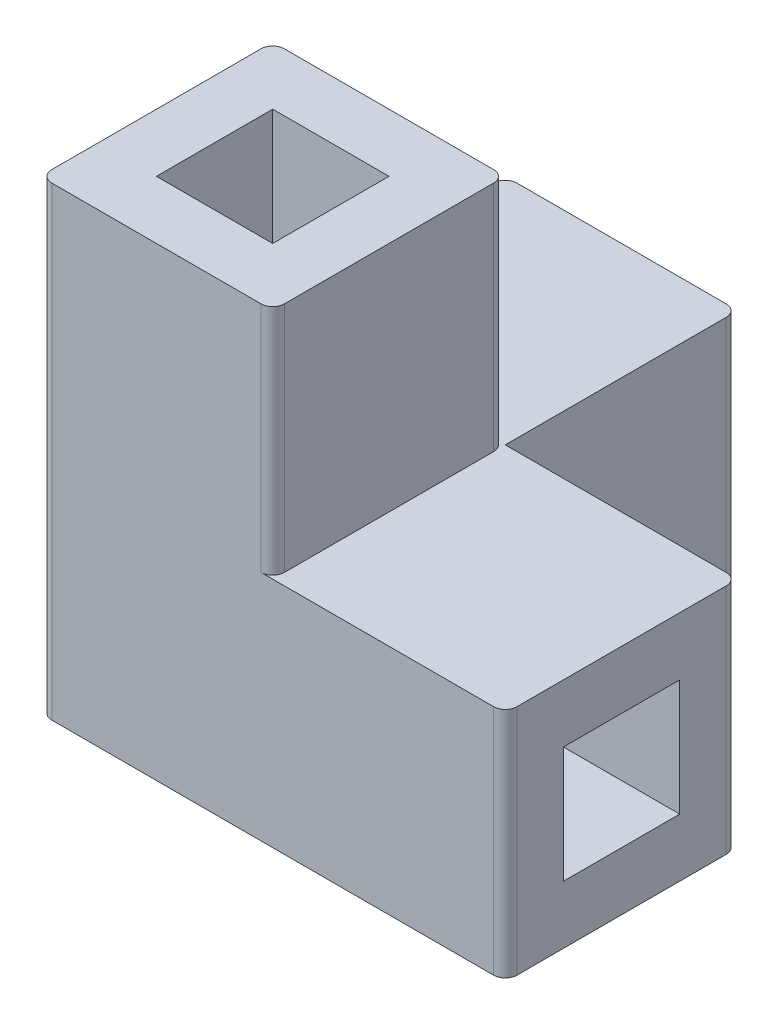
ISO-10303-21;
HEADER;
FILE_DESCRIPTION(('STEP AP214'),'2;1');
FILE_NAME('part.step','',(''),(''),'','','');
FILE_SCHEMA(('AUTOMOTIVE_DESIGN { 1 0 10303 214 1 1 1 1 }'));
ENDSEC;
DATA;
#1=APPLICATION_CONTEXT('core data for automotive mechanical design processes');
#2=APPLICATION_PROTOCOL_DEFINITION('international standard','automotive_design',2000,#1);
#3=PRODUCT_CONTEXT('',#1,'mechanical');
#4=PRODUCT('Part','Part','',(#3));
#5=PRODUCT_RELATED_PRODUCT_CATEGORY('part','',(#4));
#6=PRODUCT_DEFINITION_FORMATION('','',#4);
#7=PRODUCT_DEFINITION_CONTEXT('part definition',#1,'design');
#8=PRODUCT_DEFINITION('design','',#6,#7);
#9=PRODUCT_DEFINITION_SHAPE('','',#8);
#10=(LENGTH_UNIT() NAMED_UNIT(*) SI_UNIT(.MILLI.,.METRE.));
#11=(NAMED_UNIT(*) PLANE_ANGLE_UNIT() SI_UNIT($,.RADIAN.));
#12=(NAMED_UNIT(*) SI_UNIT($,.STERADIAN.) SOLID_ANGLE_UNIT());
#13=UNCERTAINTY_MEASURE_WITH_UNIT(LENGTH_MEASURE(1.E-05),#10,'distance_accuracy_value','');
#14=(GEOMETRIC_REPRESENTATION_CONTEXT(3) GLOBAL_UNCERTAINTY_ASSIGNED_CONTEXT((#13)) GLOBAL_UNIT_ASSIGNED_CONTEXT((#10,
#11,#12)) REPRESENTATION_CONTEXT('',''));
#15=CARTESIAN_POINT('',(0.,0.,0.));
#16=DIRECTION('',(0.,0.,1.));
#17=DIRECTION('',(1.,0.,0.));
#18=AXIS2_PLACEMENT_3D('',#15,#16,#17);
#19=CARTESIAN_POINT('',(30.,0.,-30.));
#20=DIRECTION('',(1.,0.,0.));
#21=DIRECTION('',(0.,0.,-1.));
#22=AXIS2_PLACEMENT_3D('',#19,#20,#21);
#23=PLANE('',#22);
#24=DIRECTION('',(0.,1.,0.));
#25=VECTOR('',#24,1.);
#26=CARTESIAN_POINT('',(30.,0.,-10.));
#27=LINE('',#26,#25);
#28=CARTESIAN_POINT('',(30.,0.,-10.));
#29=VERTEX_POINT('',#28);
#30=CARTESIAN_POINT('',(30.,9.99999999999999,-10.));
#31=VERTEX_POINT('',#30);
#32=EDGE_CURVE('E360',#29,#31,#27,.T.);
#33=ORIENTED_EDGE('',*,*,#32,.T.);
#34=DIRECTION('',(0.,0.,-1.));
#35=VECTOR('',#34,1.);
#36=CARTESIAN_POINT('',(30.,9.99999999999999,-30.));
#37=LINE('',#36,#35);
#38=CARTESIAN_POINT('',(30.,9.99999999999999,-30.));
#39=VERTEX_POINT('',#38);
#40=EDGE_CURVE('E277',#31,#39,#37,.T.);
#41=ORIENTED_EDGE('',*,*,#40,.T.);
#42=DIRECTION('',(0.,1.,0.));
#43=VECTOR('',#42,1.);
#44=CARTESIAN_POINT('',(30.,0.,-30.));
#45=LINE('',#44,#43);
#46=CARTESIAN_POINT('',(30.,0.,-30.));
#47=VERTEX_POINT('',#46);
#48=EDGE_CURVE('E355',#47,#39,#45,.T.);
#49=ORIENTED_EDGE('',*,*,#48,.F.);
#50=DIRECTION('',(0.,0.,-1.));
#51=VECTOR('',#50,1.);
#52=CARTESIAN_POINT('',(30.,0.,-30.));
#53=LINE('',#52,#51);
#54=EDGE_CURVE('E327',#29,#47,#53,.T.);
#55=ORIENTED_EDGE('',*,*,#54,.F.);
#56=EDGE_LOOP('',(#33,#41,#49,#55));
#57=FACE_BOUND('',#56,.T.);
#58=ADVANCED_FACE('F49',(#57),#23,.F.);
#59=DIRECTION('',(0.,0.,-1.));
#60=VECTOR('',#59,1.);
#61=CARTESIAN_POINT('',(30.,9.99999999999999,-9.99999999999999));
#62=LINE('',#61,#60);
#63=CARTESIAN_POINT('',(30.,9.99999999999999,-80.));
#64=VERTEX_POINT('',#63);
#65=EDGE_CURVE('E296',#39,#64,#62,.T.);
#66=ORIENTED_EDGE('',*,*,#65,.F.);
#67=DIRECTION('',(0.,1.,0.));
#68=VECTOR('',#67,1.);
#69=CARTESIAN_POINT('',(30.,0.,-30.));
#70=LINE('',#69,#68);
#71=CARTESIAN_POINT('',(30.,30.,-30.));
#72=VERTEX_POINT('',#71);
#73=EDGE_CURVE('E266',#39,#72,#70,.T.);
#74=ORIENTED_EDGE('',*,*,#73,.T.);
#75=DIRECTION('',(0.,0.,-1.));
#76=VECTOR('',#75,1.);
#77=CARTESIAN_POINT('',(30.,30.,-9.99999999999999));
#78=LINE('',#77,#76);
#79=CARTESIAN_POINT('',(30.,30.,-80.));
#80=VERTEX_POINT('',#79);
#81=EDGE_CURVE('E297',#72,#80,#78,.T.);
#82=ORIENTED_EDGE('',*,*,#81,.T.);
#83=DIRECTION('',(0.,-1.,0.));
#84=VECTOR('',#83,1.);
#85=CARTESIAN_POINT('',(30.,30.,-80.));
#86=LINE('',#85,#84);
#87=EDGE_CURVE('E281',#80,#64,#86,.T.);
#88=ORIENTED_EDGE('',*,*,#87,.T.);
#89=EDGE_LOOP('',(#66,#74,#82,#88));
#90=FACE_BOUND('',#89,.T.);
#91=ADVANCED_FACE('F621',(#90),#23,.F.);
#92=CARTESIAN_POINT('',(10.,0.,-30.));
#93=DIRECTION('',(0.,0.,-1.));
#94=DIRECTION('',(-1.,0.,0.));
#95=AXIS2_PLACEMENT_3D('',#92,#93,#94);
#96=PLANE('',#95);
#97=DIRECTION('',(0.,1.,0.));
#98=VECTOR('',#97,1.);
#99=CARTESIAN_POINT('',(10.,0.,-30.));
#100=LINE('',#99,#98);
#101=CARTESIAN_POINT('',(10.,30.,-30.));
#102=VERTEX_POINT('',#101);
#103=CARTESIAN_POINT('',(10.,80.,-30.));
#104=VERTEX_POINT('',#103);
#105=EDGE_CURVE('E354',#102,#104,#100,.T.);
#106=ORIENTED_EDGE('',*,*,#105,.F.);
#107=DIRECTION('',(1.,0.,0.));
#108=VECTOR('',#107,1.);
#109=CARTESIAN_POINT('',(10.,30.,-30.));
#110=LINE('',#109,#108);
#111=EDGE_CURVE('E313',#102,#72,#110,.T.);
#112=ORIENTED_EDGE('',*,*,#111,.T.);
#113=CARTESIAN_POINT('',(30.,80.,-30.));
#114=VERTEX_POINT('',#113);
#115=EDGE_CURVE('E359',#72,#114,#45,.T.);
#116=ORIENTED_EDGE('',*,*,#115,.T.);
#117=DIRECTION('',(-1.,0.,0.));
#118=VECTOR('',#117,1.);
#119=CARTESIAN_POINT('',(10.,80.,-30.));
#120=LINE('',#119,#118);
#121=EDGE_CURVE('E323',#114,#104,#120,.T.);
#122=ORIENTED_EDGE('',*,*,#121,.T.);
#123=EDGE_LOOP('',(#106,#112,#116,#122));
#124=FACE_BOUND('',#123,.T.);
#125=ADVANCED_FACE('F615',(#124),#96,.F.);
#126=CARTESIAN_POINT('',(40.,80.,0.));
#127=DIRECTION('',(1.,0.,0.));
#128=DIRECTION('',(0.,0.,-1.));
#129=AXIS2_PLACEMENT_3D('',#126,#127,#128);
#130=PLANE('',#129);
#131=DIRECTION('',(0.,0.,1.));
#132=VECTOR('',#131,1.);
#133=CARTESIAN_POINT('',(40.,80.,0.));
#134=LINE('',#133,#132);
#135=CARTESIAN_POINT('',(40.,80.,-38.));
#136=VERTEX_POINT('',#135);
#137=CARTESIAN_POINT('',(40.,80.,-2.));
#138=VERTEX_POINT('',#137);
#139=EDGE_CURVE('E390',#136,#138,#134,.T.);
#140=ORIENTED_EDGE('',*,*,#139,.T.);
#141=DIRECTION('',(0.,-1.,0.));
#142=VECTOR('',#141,1.);
#143=CARTESIAN_POINT('',(40.,40.,-2.));
#144=LINE('',#143,#142);
#145=CARTESIAN_POINT('',(40.,40.,-2.));
#146=VERTEX_POINT('',#145);
#147=EDGE_CURVE('E531',#138,#146,#144,.T.);
#148=ORIENTED_EDGE('',*,*,#147,.T.);
#149=DIRECTION('',(0.,0.,1.));
#150=VECTOR('',#149,1.);
#151=CARTESIAN_POINT('',(40.,40.,-80.));
#152=LINE('',#151,#150);
#153=CARTESIAN_POINT('',(40.,40.,-38.));
#154=VERTEX_POINT('',#153);
#155=EDGE_CURVE('E381',#154,#146,#152,.T.);
#156=ORIENTED_EDGE('',*,*,#155,.F.);
#157=DIRECTION('',(0.,-1.,0.));
#158=VECTOR('',#157,1.);
#159=CARTESIAN_POINT('',(40.,80.,-38.));
#160=LINE('',#159,#158);
#161=EDGE_CURVE('E528',#154,#136,#160,.F.);
#162=ORIENTED_EDGE('',*,*,#161,.T.);
#163=EDGE_LOOP('',(#140,#148,#156,#162));
#164=FACE_BOUND('',#163,.T.);
#165=ADVANCED_FACE('F613',(#164),#130,.T.);
#166=DIRECTION('',(0.,0.,1.));
#167=VECTOR('',#166,1.);
#168=CARTESIAN_POINT('',(40.,0.,0.));
#169=LINE('',#168,#167);
#170=CARTESIAN_POINT('',(40.,0.,-78.));
#171=VERTEX_POINT('',#170);
#172=CARTESIAN_POINT('',(40.,0.,-40.));
#173=VERTEX_POINT('',#172);
#174=EDGE_CURVE('E386',#171,#173,#169,.T.);
#175=ORIENTED_EDGE('',*,*,#174,.F.);
#176=DIRECTION('',(0.,-1.,0.));
#177=VECTOR('',#176,1.);
#178=CARTESIAN_POINT('',(40.,80.,-78.));
#179=LINE('',#178,#177);
#180=CARTESIAN_POINT('',(40.,40.,-78.));
#181=VERTEX_POINT('',#180);
#182=EDGE_CURVE('E461',#171,#181,#179,.F.);
#183=ORIENTED_EDGE('',*,*,#182,.T.);
#184=DIRECTION('',(0.,0.,-1.));
#185=VECTOR('',#184,1.);
#186=CARTESIAN_POINT('',(40.,40.,-40.));
#187=LINE('',#186,#185);
#188=CARTESIAN_POINT('',(40.,40.,-40.));
#189=VERTEX_POINT('',#188);
#190=EDGE_CURVE('E353',#189,#181,#187,.T.);
#191=ORIENTED_EDGE('',*,*,#190,.F.);
#192=DIRECTION('',(0.,-1.,0.));
#193=VECTOR('',#192,1.);
#194=CARTESIAN_POINT('',(40.,80.,-40.));
#195=LINE('',#194,#193);
#196=EDGE_CURVE('E403',#189,#173,#195,.T.);
#197=ORIENTED_EDGE('',*,*,#196,.T.);
#198=EDGE_LOOP('',(#175,#183,#191,#197));
#199=FACE_BOUND('',#198,.T.);
#200=ADVANCED_FACE('F582',(#199),#130,.T.);
#201=CARTESIAN_POINT('',(0.,80.,-80.));
#202=DIRECTION('',(0.,0.,-1.));
#203=DIRECTION('',(-1.,0.,0.));
#204=AXIS2_PLACEMENT_3D('',#201,#202,#203);
#205=PLANE('',#204);
#206=ORIENTED_EDGE('',*,*,#87,.F.);
#207=DIRECTION('',(1.,0.,0.));
#208=VECTOR('',#207,1.);
#209=CARTESIAN_POINT('',(30.,30.,-80.));
#210=LINE('',#209,#208);
#211=CARTESIAN_POINT('',(10.,30.,-80.));
#212=VERTEX_POINT('',#211);
#213=EDGE_CURVE('E292',#212,#80,#210,.T.);
#214=ORIENTED_EDGE('',*,*,#213,.F.);
#215=DIRECTION('',(0.,1.,0.));
#216=VECTOR('',#215,1.);
#217=CARTESIAN_POINT('',(10.,30.,-80.));
#218=LINE('',#217,#216);
#219=CARTESIAN_POINT('',(10.,10.,-80.));
#220=VERTEX_POINT('',#219);
#221=EDGE_CURVE('E288',#220,#212,#218,.T.);
#222=ORIENTED_EDGE('',*,*,#221,.F.);
#223=DIRECTION('',(-1.,0.,0.));
#224=VECTOR('',#223,1.);
#225=CARTESIAN_POINT('',(30.,9.99999999999999,-80.));
#226=LINE('',#225,#224);
#227=EDGE_CURVE('E284',#64,#220,#226,.T.);
#228=ORIENTED_EDGE('',*,*,#227,.F.);
#229=EDGE_LOOP('',(#206,#214,#222,#228));
#230=FACE_BOUND('',#229,.T.);
#231=DIRECTION('',(1.,0.,0.));
#232=VECTOR('',#231,1.);
#233=CARTESIAN_POINT('',(-40.,40.,-80.));
#234=LINE('',#233,#232);
#235=CARTESIAN_POINT('',(2.,40.,-80.));
#236=VERTEX_POINT('',#235);
#237=CARTESIAN_POINT('',(38.,40.,-80.));
#238=VERTEX_POINT('',#237);
#239=EDGE_CURVE('E370',#236,#238,#234,.T.);
#240=ORIENTED_EDGE('',*,*,#239,.T.);
#241=DIRECTION('',(0.,-1.,0.));
#242=VECTOR('',#241,1.);
#243=CARTESIAN_POINT('',(38.,80.,-80.));
#244=LINE('',#243,#242);
#245=CARTESIAN_POINT('',(38.,0.,-80.));
#246=VERTEX_POINT('',#245);
#247=EDGE_CURVE('E442',#238,#246,#244,.T.);
#248=ORIENTED_EDGE('',*,*,#247,.T.);
#249=DIRECTION('',(1.,0.,0.));
#250=VECTOR('',#249,1.);
#251=CARTESIAN_POINT('',(0.,0.,-80.));
#252=LINE('',#251,#250);
#253=CARTESIAN_POINT('',(2.,0.,-80.));
#254=VERTEX_POINT('',#253);
#255=EDGE_CURVE('E407',#254,#246,#252,.T.);
#256=ORIENTED_EDGE('',*,*,#255,.F.);
#257=DIRECTION('',(0.,-1.,0.));
#258=VECTOR('',#257,1.);
#259=CARTESIAN_POINT('',(2.,80.,-80.));
#260=LINE('',#259,#258);
#261=EDGE_CURVE('E439',#254,#236,#260,.F.);
#262=ORIENTED_EDGE('',*,*,#261,.T.);
#263=EDGE_LOOP('',(#240,#248,#256,#262));
#264=FACE_BOUND('',#263,.T.);
#265=ADVANCED_FACE('F590',(#230,#264),#205,.T.);
#266=CARTESIAN_POINT('',(0.,80.,0.));
#267=DIRECTION('',(-1.,0.,0.));
#268=DIRECTION('',(0.,0.,1.));
#269=AXIS2_PLACEMENT_3D('',#266,#267,#268);
#270=PLANE('',#269);
#271=DIRECTION('',(0.,0.,1.));
#272=VECTOR('',#271,1.);
#273=CARTESIAN_POINT('',(0.,40.,0.));
#274=LINE('',#273,#272);
#275=CARTESIAN_POINT('',(0.,40.,-78.));
#276=VERTEX_POINT('',#275);
#277=CARTESIAN_POINT('',(0.,40.,-38.));
#278=VERTEX_POINT('',#277);
#279=EDGE_CURVE('E436',#276,#278,#274,.T.);
#280=ORIENTED_EDGE('',*,*,#279,.F.);
#281=DIRECTION('',(0.,-1.,0.));
#282=VECTOR('',#281,1.);
#283=CARTESIAN_POINT('',(0.,80.,-78.));
#284=LINE('',#283,#282);
#285=CARTESIAN_POINT('',(0.,0.,-78.));
#286=VERTEX_POINT('',#285);
#287=EDGE_CURVE('E477',#276,#286,#284,.T.);
#288=ORIENTED_EDGE('',*,*,#287,.T.);
#289=DIRECTION('',(0.,0.,-1.));
#290=VECTOR('',#289,1.);
#291=CARTESIAN_POINT('',(0.,0.,0.));
#292=LINE('',#291,#290);
#293=CARTESIAN_POINT('',(0.,0.,-2.));
#294=VERTEX_POINT('',#293);
#295=EDGE_CURVE('E411',#294,#286,#292,.T.);
#296=ORIENTED_EDGE('',*,*,#295,.F.);
#297=DIRECTION('',(0.,-1.,0.));
#298=VECTOR('',#297,1.);
#299=CARTESIAN_POINT('',(0.,80.,-2.));
#300=LINE('',#299,#298);
#301=CARTESIAN_POINT('',(0.,80.,-2.));
#302=VERTEX_POINT('',#301);
#303=EDGE_CURVE('E470',#294,#302,#300,.F.);
#304=ORIENTED_EDGE('',*,*,#303,.T.);
#305=DIRECTION('',(0.,0.,-1.));
#306=VECTOR('',#305,1.);
#307=CARTESIAN_POINT('',(0.,80.,0.));
#308=LINE('',#307,#306);
#309=CARTESIAN_POINT('',(0.,80.,-38.));
#310=VERTEX_POINT('',#309);
#311=EDGE_CURVE('E394',#302,#310,#308,.T.);
#312=ORIENTED_EDGE('',*,*,#311,.T.);
#313=DIRECTION('',(0.,1.,0.));
#314=VECTOR('',#313,1.);
#315=CARTESIAN_POINT('',(0.,40.,-38.));
#316=LINE('',#315,#314);
#317=EDGE_CURVE('E473',#310,#278,#316,.F.);
#318=ORIENTED_EDGE('',*,*,#317,.T.);
#319=EDGE_LOOP('',(#280,#288,#296,#304,#312,#318));
#320=FACE_BOUND('',#319,.T.);
#321=ADVANCED_FACE('F598',(#320),#270,.T.);
#322=CARTESIAN_POINT('',(0.,80.,0.));
#323=DIRECTION('',(0.,0.,-1.));
#324=DIRECTION('',(-1.,0.,0.));
#325=AXIS2_PLACEMENT_3D('',#322,#323,#324);
#326=PLANE('',#325);
#327=DIRECTION('',(1.,0.,0.));
#328=VECTOR('',#327,1.);
#329=CARTESIAN_POINT('',(0.,0.,0.));
#330=LINE('',#329,#328);
#331=CARTESIAN_POINT('',(2.,0.,0.));
#332=VERTEX_POINT('',#331);
#333=CARTESIAN_POINT('',(78.,0.,0.));
#334=VERTEX_POINT('',#333);
#335=EDGE_CURVE('E415',#332,#334,#330,.T.);
#336=ORIENTED_EDGE('',*,*,#335,.T.);
#337=DIRECTION('',(0.,-1.,0.));
#338=VECTOR('',#337,1.);
#339=CARTESIAN_POINT('',(78.,80.,0.));
#340=LINE('',#339,#338);
#341=CARTESIAN_POINT('',(78.,40.,0.));
#342=VERTEX_POINT('',#341);
#343=EDGE_CURVE('E515',#334,#342,#340,.F.);
#344=ORIENTED_EDGE('',*,*,#343,.T.);
#345=DIRECTION('',(1.,0.,0.));
#346=VECTOR('',#345,1.);
#347=CARTESIAN_POINT('',(80.,40.,0.));
#348=LINE('',#347,#346);
#349=CARTESIAN_POINT('',(38.,40.,0.));
#350=VERTEX_POINT('',#349);
#351=EDGE_CURVE('E374',#350,#342,#348,.T.);
#352=ORIENTED_EDGE('',*,*,#351,.F.);
#353=DIRECTION('',(0.,-1.,0.));
#354=VECTOR('',#353,1.);
#355=CARTESIAN_POINT('',(38.,80.,0.));
#356=LINE('',#355,#354);
#357=CARTESIAN_POINT('',(38.,80.,0.));
#358=VERTEX_POINT('',#357);
#359=EDGE_CURVE('E512',#350,#358,#356,.F.);
#360=ORIENTED_EDGE('',*,*,#359,.T.);
#361=DIRECTION('',(1.,0.,0.));
#362=VECTOR('',#361,1.);
#363=CARTESIAN_POINT('',(0.,80.,0.));
#364=LINE('',#363,#362);
#365=CARTESIAN_POINT('',(2.,80.,0.));
#366=VERTEX_POINT('',#365);
#367=EDGE_CURVE('E399',#366,#358,#364,.T.);
#368=ORIENTED_EDGE('',*,*,#367,.F.);
#369=DIRECTION('',(0.,-1.,0.));
#370=VECTOR('',#369,1.);
#371=CARTESIAN_POINT('',(2.,0.,0.));
#372=LINE('',#371,#370);
#373=EDGE_CURVE('E508',#366,#332,#372,.T.);
#374=ORIENTED_EDGE('',*,*,#373,.T.);
#375=EDGE_LOOP('',(#336,#344,#352,#360,#368,#374));
#376=FACE_BOUND('',#375,.T.);
#377=ADVANCED_FACE('F549',(#376),#326,.F.);
#378=CARTESIAN_POINT('',(80.,80.,0.));
#379=DIRECTION('',(-1.,0.,0.));
#380=DIRECTION('',(0.,0.,1.));
#381=AXIS2_PLACEMENT_3D('',#378,#379,#380);
#382=PLANE('',#381);
#383=DIRECTION('',(0.,0.,1.));
#384=VECTOR('',#383,1.);
#385=CARTESIAN_POINT('',(80.,30.,-30.));
#386=LINE('',#385,#384);
#387=CARTESIAN_POINT('',(80.,30.,-30.));
#388=VERTEX_POINT('',#387);
#389=CARTESIAN_POINT('',(80.,30.,-10.));
#390=VERTEX_POINT('',#389);
#391=EDGE_CURVE('E248',#388,#390,#386,.T.);
#392=ORIENTED_EDGE('',*,*,#391,.F.);
#393=DIRECTION('',(0.,1.,0.));
#394=VECTOR('',#393,1.);
#395=CARTESIAN_POINT('',(80.,30.,-30.));
#396=LINE('',#395,#394);
#397=CARTESIAN_POINT('',(80.,9.99999999999999,-30.));
#398=VERTEX_POINT('',#397);
#399=EDGE_CURVE('E65',#398,#388,#396,.T.);
#400=ORIENTED_EDGE('',*,*,#399,.F.);
#401=DIRECTION('',(0.,0.,-1.));
#402=VECTOR('',#401,1.);
#403=CARTESIAN_POINT('',(80.,9.99999999999999,-30.));
#404=LINE('',#403,#402);
#405=CARTESIAN_POINT('',(80.,9.99999999999999,-10.));
#406=VERTEX_POINT('',#405);
#407=EDGE_CURVE('E256',#406,#398,#404,.T.);
#408=ORIENTED_EDGE('',*,*,#407,.F.);
#409=DIRECTION('',(0.,-1.,0.));
#410=VECTOR('',#409,1.);
#411=CARTESIAN_POINT('',(80.,30.,-10.));
#412=LINE('',#411,#410);
#413=EDGE_CURVE('E239',#390,#406,#412,.T.);
#414=ORIENTED_EDGE('',*,*,#413,.F.);
#415=EDGE_LOOP('',(#392,#400,#408,#414));
#416=FACE_BOUND('',#415,.T.);
#417=DIRECTION('',(0.,0.,1.));
#418=VECTOR('',#417,1.);
#419=CARTESIAN_POINT('',(80.,40.,-80.));
#420=LINE('',#419,#418);
#421=CARTESIAN_POINT('',(80.,40.,-38.));
#422=VERTEX_POINT('',#421);
#423=CARTESIAN_POINT('',(80.,40.,-2.));
#424=VERTEX_POINT('',#423);
#425=EDGE_CURVE('E382',#422,#424,#420,.T.);
#426=ORIENTED_EDGE('',*,*,#425,.T.);
#427=DIRECTION('',(0.,-1.,0.));
#428=VECTOR('',#427,1.);
#429=CARTESIAN_POINT('',(80.,80.,-2.));
#430=LINE('',#429,#428);
#431=CARTESIAN_POINT('',(80.,0.,-2.));
#432=VERTEX_POINT('',#431);
#433=EDGE_CURVE('E504',#424,#432,#430,.T.);
#434=ORIENTED_EDGE('',*,*,#433,.T.);
#435=DIRECTION('',(0.,0.,-1.));
#436=VECTOR('',#435,1.);
#437=CARTESIAN_POINT('',(80.,0.,0.));
#438=LINE('',#437,#436);
#439=CARTESIAN_POINT('',(80.,0.,-38.));
#440=VERTEX_POINT('',#439);
#441=EDGE_CURVE('E419',#432,#440,#438,.T.);
#442=ORIENTED_EDGE('',*,*,#441,.T.);
#443=DIRECTION('',(0.,-1.,0.));
#444=VECTOR('',#443,1.);
#445=CARTESIAN_POINT('',(80.,80.,-38.));
#446=LINE('',#445,#444);
#447=EDGE_CURVE('E501',#440,#422,#446,.F.);
#448=ORIENTED_EDGE('',*,*,#447,.T.);
#449=EDGE_LOOP('',(#426,#434,#442,#448));
#450=FACE_BOUND('',#449,.T.);
#451=ADVANCED_FACE('F253',(#416,#450),#382,.F.);
#452=CARTESIAN_POINT('',(0.,80.,-40.));
#453=DIRECTION('',(0.,0.,1.));
#454=DIRECTION('',(1.,0.,0.));
#455=AXIS2_PLACEMENT_3D('',#452,#453,#454);
#456=PLANE('',#455);
#457=DIRECTION('',(1.,0.,0.));
#458=VECTOR('',#457,1.);
#459=CARTESIAN_POINT('',(0.,40.,-40.));
#460=LINE('',#459,#458);
#461=CARTESIAN_POINT('',(78.,40.,-40.));
#462=VERTEX_POINT('',#461);
#463=EDGE_CURVE('E428',#189,#462,#460,.T.);
#464=ORIENTED_EDGE('',*,*,#463,.T.);
#465=DIRECTION('',(0.,-1.,0.));
#466=VECTOR('',#465,1.);
#467=CARTESIAN_POINT('',(78.,80.,-40.));
#468=LINE('',#467,#466);
#469=CARTESIAN_POINT('',(78.,0.,-40.));
#470=VERTEX_POINT('',#469);
#471=EDGE_CURVE('E524',#462,#470,#468,.T.);
#472=ORIENTED_EDGE('',*,*,#471,.T.);
#473=DIRECTION('',(-1.,0.,0.));
#474=VECTOR('',#473,1.);
#475=CARTESIAN_POINT('',(0.,0.,-40.));
#476=LINE('',#475,#474);
#477=EDGE_CURVE('E395',#470,#173,#476,.T.);
#478=ORIENTED_EDGE('',*,*,#477,.T.);
#479=ORIENTED_EDGE('',*,*,#196,.F.);
#480=EDGE_LOOP('',(#464,#472,#478,#479));
#481=FACE_BOUND('',#480,.T.);
#482=ADVANCED_FACE('F577',(#481),#456,.F.);
#483=CARTESIAN_POINT('',(0.,80.,0.));
#484=DIRECTION('',(0.,1.,0.));
#485=DIRECTION('',(0.,0.,1.));
#486=AXIS2_PLACEMENT_3D('',#483,#484,#485);
#487=PLANE('',#486);
#488=DIRECTION('',(0.,0.,1.));
#489=VECTOR('',#488,1.);
#490=CARTESIAN_POINT('',(10.,80.,-30.));
#491=LINE('',#490,#489);
#492=CARTESIAN_POINT('',(10.,80.,-10.));
#493=VERTEX_POINT('',#492);
#494=EDGE_CURVE('E317',#104,#493,#491,.T.);
#495=ORIENTED_EDGE('',*,*,#494,.F.);
#496=ORIENTED_EDGE('',*,*,#121,.F.);
#497=DIRECTION('',(0.,0.,-1.));
#498=VECTOR('',#497,1.);
#499=CARTESIAN_POINT('',(30.,80.,-30.));
#500=LINE('',#499,#498);
#501=CARTESIAN_POINT('',(30.,80.,-10.));
#502=VERTEX_POINT('',#501);
#503=EDGE_CURVE('E342',#502,#114,#500,.T.);
#504=ORIENTED_EDGE('',*,*,#503,.F.);
#505=DIRECTION('',(1.,0.,0.));
#506=VECTOR('',#505,1.);
#507=CARTESIAN_POINT('',(10.,80.,-10.));
#508=LINE('',#507,#506);
#509=EDGE_CURVE('E339',#493,#502,#508,.T.);
#510=ORIENTED_EDGE('',*,*,#509,.F.);
#511=EDGE_LOOP('',(#495,#496,#504,#510));
#512=FACE_BOUND('',#511,.T.);
#513=DIRECTION('',(1.,0.,0.));
#514=VECTOR('',#513,1.);
#515=CARTESIAN_POINT('',(0.,80.,-40.));
#516=LINE('',#515,#514);
#517=CARTESIAN_POINT('',(2.,80.,-40.));
#518=VERTEX_POINT('',#517);
#519=CARTESIAN_POINT('',(38.,80.,-40.));
#520=VERTEX_POINT('',#519);
#521=EDGE_CURVE('E432',#518,#520,#516,.T.);
#522=ORIENTED_EDGE('',*,*,#521,.F.);
#523=CARTESIAN_POINT('',(2.,80.,-38.));
#524=DIRECTION('',(0.,1.,0.));
#525=DIRECTION('',(0.,0.,1.));
#526=AXIS2_PLACEMENT_3D('',#523,#524,#525);
#527=CIRCLE('',#526,2.);
#528=EDGE_CURVE('E498',#518,#310,#527,.T.);
#529=ORIENTED_EDGE('',*,*,#528,.T.);
#530=ORIENTED_EDGE('',*,*,#311,.F.);
#531=CARTESIAN_POINT('',(2.,80.,-2.));
#532=DIRECTION('',(0.,1.,0.));
#533=DIRECTION('',(0.,0.,1.));
#534=AXIS2_PLACEMENT_3D('',#531,#532,#533);
#535=CIRCLE('',#534,2.);
#536=EDGE_CURVE('E489',#302,#366,#535,.T.);
#537=ORIENTED_EDGE('',*,*,#536,.T.);
#538=ORIENTED_EDGE('',*,*,#367,.T.);
#539=CARTESIAN_POINT('',(38.,80.,-2.));
#540=DIRECTION('',(0.,1.,0.));
#541=DIRECTION('',(0.,0.,1.));
#542=AXIS2_PLACEMENT_3D('',#539,#540,#541);
#543=CIRCLE('',#542,2.);
#544=EDGE_CURVE('E495',#358,#138,#543,.T.);
#545=ORIENTED_EDGE('',*,*,#544,.T.);
#546=ORIENTED_EDGE('',*,*,#139,.F.);
#547=CARTESIAN_POINT('',(38.,80.,-38.));
#548=DIRECTION('',(0.,1.,0.));
#549=DIRECTION('',(0.,0.,1.));
#550=AXIS2_PLACEMENT_3D('',#547,#548,#549);
#551=CIRCLE('',#550,2.);
#552=EDGE_CURVE('E492',#136,#520,#551,.T.);
#553=ORIENTED_EDGE('',*,*,#552,.T.);
#554=EDGE_LOOP('',(#522,#529,#530,#537,#538,#545,#546,#553));
#555=FACE_BOUND('',#554,.T.);
#556=ADVANCED_FACE('F553',(#512,#555),#487,.T.);
#557=CARTESIAN_POINT('',(0.,0.,0.));
#558=DIRECTION('',(0.,1.,0.));
#559=DIRECTION('',(0.,0.,1.));
#560=AXIS2_PLACEMENT_3D('',#557,#558,#559);
#561=PLANE('',#560);
#562=DIRECTION('',(-1.,0.,0.));
#563=VECTOR('',#562,1.);
#564=CARTESIAN_POINT('',(10.,0.,-30.));
#565=LINE('',#564,#563);
#566=CARTESIAN_POINT('',(10.,0.,-30.));
#567=VERTEX_POINT('',#566);
#568=EDGE_CURVE('E331',#47,#567,#565,.T.);
#569=ORIENTED_EDGE('',*,*,#568,.T.);
#570=DIRECTION('',(0.,0.,1.));
#571=VECTOR('',#570,1.);
#572=CARTESIAN_POINT('',(10.,0.,-30.));
#573=LINE('',#572,#571);
#574=CARTESIAN_POINT('',(10.,0.,-10.));
#575=VERTEX_POINT('',#574);
#576=EDGE_CURVE('E318',#567,#575,#573,.T.);
#577=ORIENTED_EDGE('',*,*,#576,.T.);
#578=DIRECTION('',(1.,0.,0.));
#579=VECTOR('',#578,1.);
#580=CARTESIAN_POINT('',(10.,0.,-10.));
#581=LINE('',#580,#579);
#582=EDGE_CURVE('E322',#575,#29,#581,.T.);
#583=ORIENTED_EDGE('',*,*,#582,.T.);
#584=ORIENTED_EDGE('',*,*,#54,.T.);
#585=EDGE_LOOP('',(#569,#577,#583,#584));
#586=FACE_BOUND('',#585,.T.);
#587=ORIENTED_EDGE('',*,*,#255,.T.);
#588=CARTESIAN_POINT('',(38.,0.,-78.));
#589=DIRECTION('',(0.,1.,0.));
#590=DIRECTION('',(0.,0.,1.));
#591=AXIS2_PLACEMENT_3D('',#588,#589,#590);
#592=CIRCLE('',#591,2.);
#593=EDGE_CURVE('E458',#246,#171,#592,.F.);
#594=ORIENTED_EDGE('',*,*,#593,.T.);
#595=ORIENTED_EDGE('',*,*,#174,.T.);
#596=ORIENTED_EDGE('',*,*,#477,.F.);
#597=CARTESIAN_POINT('',(78.,0.,-38.));
#598=DIRECTION('',(0.,1.,0.));
#599=DIRECTION('',(0.,0.,1.));
#600=AXIS2_PLACEMENT_3D('',#597,#598,#599);
#601=CIRCLE('',#600,2.);
#602=EDGE_CURVE('E449',#470,#440,#601,.F.);
#603=ORIENTED_EDGE('',*,*,#602,.T.);
#604=ORIENTED_EDGE('',*,*,#441,.F.);
#605=CARTESIAN_POINT('',(78.,0.,-2.));
#606=DIRECTION('',(0.,1.,0.));
#607=DIRECTION('',(0.,0.,1.));
#608=AXIS2_PLACEMENT_3D('',#605,#606,#607);
#609=CIRCLE('',#608,2.);
#610=EDGE_CURVE('E452',#432,#334,#609,.F.);
#611=ORIENTED_EDGE('',*,*,#610,.T.);
#612=ORIENTED_EDGE('',*,*,#335,.F.);
#613=CARTESIAN_POINT('',(2.,0.,-2.));
#614=DIRECTION('',(0.,1.,0.));
#615=DIRECTION('',(0.,0.,1.));
#616=AXIS2_PLACEMENT_3D('',#613,#614,#615);
#617=CIRCLE('',#616,2.);
#618=EDGE_CURVE('E446',#332,#294,#617,.F.);
#619=ORIENTED_EDGE('',*,*,#618,.T.);
#620=ORIENTED_EDGE('',*,*,#295,.T.);
#621=CARTESIAN_POINT('',(2.,0.,-78.));
#622=DIRECTION('',(0.,1.,0.));
#623=DIRECTION('',(0.,0.,1.));
#624=AXIS2_PLACEMENT_3D('',#621,#622,#623);
#625=CIRCLE('',#624,2.);
#626=EDGE_CURVE('E455',#286,#254,#625,.F.);
#627=ORIENTED_EDGE('',*,*,#626,.T.);
#628=EDGE_LOOP('',(#587,#594,#595,#596,#603,#604,#611,#612,#619,#620,#627));
#629=FACE_BOUND('',#628,.T.);
#630=ADVANCED_FACE('F562',(#586,#629),#561,.F.);
#631=CARTESIAN_POINT('',(-40.,40.,-40.));
#632=DIRECTION('',(0.,0.,1.));
#633=DIRECTION('',(1.,0.,0.));
#634=AXIS2_PLACEMENT_3D('',#631,#632,#633);
#635=PLANE('',#634);
#636=DIRECTION('',(1.,0.,0.));
#637=VECTOR('',#636,1.);
#638=CARTESIAN_POINT('',(-40.,40.,-40.));
#639=LINE('',#638,#637);
#640=CARTESIAN_POINT('',(2.,40.,-40.));
#641=VERTEX_POINT('',#640);
#642=CARTESIAN_POINT('',(38.,40.,-40.));
#643=VERTEX_POINT('',#642);
#644=EDGE_CURVE('E369',#641,#643,#639,.T.);
#645=ORIENTED_EDGE('',*,*,#644,.F.);
#646=DIRECTION('',(0.,1.,0.));
#647=VECTOR('',#646,1.);
#648=CARTESIAN_POINT('',(2.,80.,-40.));
#649=LINE('',#648,#647);
#650=EDGE_CURVE('E485',#641,#518,#649,.T.);
#651=ORIENTED_EDGE('',*,*,#650,.T.);
#652=ORIENTED_EDGE('',*,*,#521,.T.);
#653=DIRECTION('',(0.,-1.,0.));
#654=VECTOR('',#653,1.);
#655=CARTESIAN_POINT('',(38.,40.,-40.));
#656=LINE('',#655,#654);
#657=EDGE_CURVE('E481',#520,#643,#656,.T.);
#658=ORIENTED_EDGE('',*,*,#657,.T.);
#659=EDGE_LOOP('',(#645,#651,#652,#658));
#660=FACE_BOUND('',#659,.T.);
#661=ADVANCED_FACE('F605',(#660),#635,.F.);
#662=CARTESIAN_POINT('',(-40.,40.,-40.));
#663=DIRECTION('',(0.,-1.,0.));
#664=DIRECTION('',(0.,0.,-1.));
#665=AXIS2_PLACEMENT_3D('',#662,#663,#664);
#666=PLANE('',#665);
#667=ORIENTED_EDGE('',*,*,#190,.T.);
#668=CARTESIAN_POINT('',(38.,40.,-78.));
#669=DIRECTION('',(0.,-1.,0.));
#670=DIRECTION('',(0.,0.,-1.));
#671=AXIS2_PLACEMENT_3D('',#668,#669,#670);
#672=CIRCLE('',#671,2.);
#673=EDGE_CURVE('E467',#181,#238,#672,.F.);
#674=ORIENTED_EDGE('',*,*,#673,.T.);
#675=ORIENTED_EDGE('',*,*,#239,.F.);
#676=CARTESIAN_POINT('',(2.,40.,-78.));
#677=DIRECTION('',(0.,-1.,0.));
#678=DIRECTION('',(0.,0.,-1.));
#679=AXIS2_PLACEMENT_3D('',#676,#677,#678);
#680=CIRCLE('',#679,2.);
#681=EDGE_CURVE('E464',#236,#276,#680,.F.);
#682=ORIENTED_EDGE('',*,*,#681,.T.);
#683=ORIENTED_EDGE('',*,*,#279,.T.);
#684=CARTESIAN_POINT('',(2.,40.,-38.));
#685=DIRECTION('',(0.,-1.,0.));
#686=DIRECTION('',(0.,0.,-1.));
#687=AXIS2_PLACEMENT_3D('',#684,#685,#686);
#688=CIRCLE('',#687,2.);
#689=EDGE_CURVE('E535',#278,#641,#688,.T.);
#690=ORIENTED_EDGE('',*,*,#689,.T.);
#691=ORIENTED_EDGE('',*,*,#644,.T.);
#692=CARTESIAN_POINT('',(38.,40.,-38.));
#693=DIRECTION('',(0.,-1.,0.));
#694=DIRECTION('',(0.,0.,-1.));
#695=AXIS2_PLACEMENT_3D('',#692,#693,#694);
#696=CIRCLE('',#695,2.);
#697=EDGE_CURVE('E11',#643,#154,#696,.T.);
#698=ORIENTED_EDGE('',*,*,#697,.T.);
#699=ORIENTED_EDGE('',*,*,#155,.T.);
#700=CARTESIAN_POINT('',(38.,40.,-2.));
#701=DIRECTION('',(0.,-1.,0.));
#702=DIRECTION('',(1.,0.,0.));
#703=AXIS2_PLACEMENT_3D('',#700,#701,#702);
#704=CIRCLE('',#703,2.);
#705=EDGE_CURVE('E58',#146,#350,#704,.T.);
#706=ORIENTED_EDGE('',*,*,#705,.T.);
#707=ORIENTED_EDGE('',*,*,#351,.T.);
#708=CARTESIAN_POINT('',(78.,40.,-2.));
#709=DIRECTION('',(0.,-1.,0.));
#710=DIRECTION('',(1.,0.,0.));
#711=AXIS2_PLACEMENT_3D('',#708,#709,#710);
#712=CIRCLE('',#711,2.);
#713=EDGE_CURVE('E521',#342,#424,#712,.F.);
#714=ORIENTED_EDGE('',*,*,#713,.T.);
#715=ORIENTED_EDGE('',*,*,#425,.F.);
#716=CARTESIAN_POINT('',(78.,40.,-38.));
#717=DIRECTION('',(0.,-1.,0.));
#718=DIRECTION('',(1.,0.,0.));
#719=AXIS2_PLACEMENT_3D('',#716,#717,#718);
#720=CIRCLE('',#719,2.);
#721=EDGE_CURVE('E518',#422,#462,#720,.F.);
#722=ORIENTED_EDGE('',*,*,#721,.T.);
#723=ORIENTED_EDGE('',*,*,#463,.F.);
#724=EDGE_LOOP('',(#667,#674,#675,#682,#683,#690,#691,#698,#699,#706,#707,#714,#715,#722,#723));
#725=FACE_BOUND('',#724,.T.);
#726=ADVANCED_FACE('F541',(#725),#666,.F.);
#727=CARTESIAN_POINT('',(38.,80.,-78.));
#728=DIRECTION('',(0.,-1.,0.));
#729=DIRECTION('',(0.,0.,-1.));
#730=AXIS2_PLACEMENT_3D('',#727,#728,#729);
#731=CYLINDRICAL_SURFACE('',#730,2.);
#732=ORIENTED_EDGE('',*,*,#673,.F.);
#733=ORIENTED_EDGE('',*,*,#182,.F.);
#734=ORIENTED_EDGE('',*,*,#593,.F.);
#735=ORIENTED_EDGE('',*,*,#247,.F.);
#736=EDGE_LOOP('',(#732,#733,#734,#735));
#737=FACE_BOUND('',#736,.T.);
#738=ADVANCED_FACE('F587',(#737),#731,.T.);
#739=CARTESIAN_POINT('',(2.,80.,-78.));
#740=DIRECTION('',(0.,-1.,0.));
#741=DIRECTION('',(0.,0.,-1.));
#742=AXIS2_PLACEMENT_3D('',#739,#740,#741);
#743=CYLINDRICAL_SURFACE('',#742,2.);
#744=ORIENTED_EDGE('',*,*,#681,.F.);
#745=ORIENTED_EDGE('',*,*,#261,.F.);
#746=ORIENTED_EDGE('',*,*,#626,.F.);
#747=ORIENTED_EDGE('',*,*,#287,.F.);
#748=EDGE_LOOP('',(#744,#745,#746,#747));
#749=FACE_BOUND('',#748,.T.);
#750=ADVANCED_FACE('F595',(#749),#743,.T.);
#751=CARTESIAN_POINT('',(2.,40.,-38.));
#752=DIRECTION('',(0.,-1.,0.));
#753=DIRECTION('',(0.,0.,-1.));
#754=AXIS2_PLACEMENT_3D('',#751,#752,#753);
#755=CYLINDRICAL_SURFACE('',#754,2.);
#756=ORIENTED_EDGE('',*,*,#689,.F.);
#757=ORIENTED_EDGE('',*,*,#317,.F.);
#758=ORIENTED_EDGE('',*,*,#528,.F.);
#759=ORIENTED_EDGE('',*,*,#650,.F.);
#760=EDGE_LOOP('',(#756,#757,#758,#759));
#761=FACE_BOUND('',#760,.T.);
#762=ADVANCED_FACE('F607',(#761),#755,.T.);
#763=CARTESIAN_POINT('',(78.,80.,-2.));
#764=DIRECTION('',(0.,-1.,0.));
#765=DIRECTION('',(0.,0.,-1.));
#766=AXIS2_PLACEMENT_3D('',#763,#764,#765);
#767=CYLINDRICAL_SURFACE('',#766,2.);
#768=ORIENTED_EDGE('',*,*,#713,.F.);
#769=ORIENTED_EDGE('',*,*,#343,.F.);
#770=ORIENTED_EDGE('',*,*,#610,.F.);
#771=ORIENTED_EDGE('',*,*,#433,.F.);
#772=EDGE_LOOP('',(#768,#769,#770,#771));
#773=FACE_BOUND('',#772,.T.);
#774=ADVANCED_FACE('F567',(#773),#767,.T.);
#775=CARTESIAN_POINT('',(78.,80.,-38.));
#776=DIRECTION('',(0.,-1.,0.));
#777=DIRECTION('',(0.,0.,-1.));
#778=AXIS2_PLACEMENT_3D('',#775,#776,#777);
#779=CYLINDRICAL_SURFACE('',#778,2.);
#780=ORIENTED_EDGE('',*,*,#721,.F.);
#781=ORIENTED_EDGE('',*,*,#447,.F.);
#782=ORIENTED_EDGE('',*,*,#602,.F.);
#783=ORIENTED_EDGE('',*,*,#471,.F.);
#784=EDGE_LOOP('',(#780,#781,#782,#783));
#785=FACE_BOUND('',#784,.T.);
#786=ADVANCED_FACE('F574',(#785),#779,.T.);
#787=CARTESIAN_POINT('',(38.,80.,-2.));
#788=DIRECTION('',(0.,1.,0.));
#789=DIRECTION('',(0.,0.,1.));
#790=AXIS2_PLACEMENT_3D('',#787,#788,#789);
#791=CYLINDRICAL_SURFACE('',#790,2.);
#792=ORIENTED_EDGE('',*,*,#544,.F.);
#793=ORIENTED_EDGE('',*,*,#359,.F.);
#794=ORIENTED_EDGE('',*,*,#705,.F.);
#795=ORIENTED_EDGE('',*,*,#147,.F.);
#796=EDGE_LOOP('',(#792,#793,#794,#795));
#797=FACE_BOUND('',#796,.T.);
#798=ADVANCED_FACE('F546',(#797),#791,.T.);
#799=CARTESIAN_POINT('',(38.,40.,-38.));
#800=DIRECTION('',(0.,1.,0.));
#801=DIRECTION('',(0.,0.,1.));
#802=AXIS2_PLACEMENT_3D('',#799,#800,#801);
#803=CYLINDRICAL_SURFACE('',#802,2.);
#804=ORIENTED_EDGE('',*,*,#552,.F.);
#805=ORIENTED_EDGE('',*,*,#161,.F.);
#806=ORIENTED_EDGE('',*,*,#697,.F.);
#807=ORIENTED_EDGE('',*,*,#657,.F.);
#808=EDGE_LOOP('',(#804,#805,#806,#807));
#809=FACE_BOUND('',#808,.T.);
#810=ADVANCED_FACE('F610',(#809),#803,.T.);
#811=CARTESIAN_POINT('',(2.,80.,-2.));
#812=DIRECTION('',(0.,1.,0.));
#813=DIRECTION('',(0.,0.,1.));
#814=AXIS2_PLACEMENT_3D('',#811,#812,#813);
#815=CYLINDRICAL_SURFACE('',#814,2.);
#816=ORIENTED_EDGE('',*,*,#536,.F.);
#817=ORIENTED_EDGE('',*,*,#303,.F.);
#818=ORIENTED_EDGE('',*,*,#618,.F.);
#819=ORIENTED_EDGE('',*,*,#373,.F.);
#820=EDGE_LOOP('',(#816,#817,#818,#819));
#821=FACE_BOUND('',#820,.T.);
#822=ADVANCED_FACE('F51',(#821),#815,.T.);
#823=CARTESIAN_POINT('',(10.,0.,-30.));
#824=DIRECTION('',(-1.,0.,0.));
#825=DIRECTION('',(0.,0.,1.));
#826=AXIS2_PLACEMENT_3D('',#823,#824,#825);
#827=PLANE('',#826);
#828=ORIENTED_EDGE('',*,*,#494,.T.);
#829=DIRECTION('',(0.,1.,0.));
#830=VECTOR('',#829,1.);
#831=CARTESIAN_POINT('',(10.,0.,-10.));
#832=LINE('',#831,#830);
#833=EDGE_CURVE('E335',#575,#493,#832,.T.);
#834=ORIENTED_EDGE('',*,*,#833,.F.);
#835=ORIENTED_EDGE('',*,*,#576,.F.);
#836=CARTESIAN_POINT('',(10.,9.99999999999999,-30.));
#837=VERTEX_POINT('',#836);
#838=EDGE_CURVE('E349',#567,#837,#100,.T.);
#839=ORIENTED_EDGE('',*,*,#838,.T.);
#840=DIRECTION('',(0.,0.,-1.));
#841=VECTOR('',#840,1.);
#842=CARTESIAN_POINT('',(10.,10.,-9.99999999999999));
#843=LINE('',#842,#841);
#844=EDGE_CURVE('E304',#837,#220,#843,.T.);
#845=ORIENTED_EDGE('',*,*,#844,.T.);
#846=ORIENTED_EDGE('',*,*,#221,.T.);
#847=DIRECTION('',(0.,0.,-1.));
#848=VECTOR('',#847,1.);
#849=CARTESIAN_POINT('',(10.,30.,-9.99999999999999));
#850=LINE('',#849,#848);
#851=EDGE_CURVE('E301',#102,#212,#850,.T.);
#852=ORIENTED_EDGE('',*,*,#851,.F.);
#853=ORIENTED_EDGE('',*,*,#105,.T.);
#854=EDGE_LOOP('',(#828,#834,#835,#839,#845,#846,#852,#853));
#855=FACE_BOUND('',#854,.T.);
#856=ADVANCED_FACE('F644',(#855),#827,.F.);
#857=ORIENTED_EDGE('',*,*,#48,.T.);
#858=DIRECTION('',(-1.,0.,0.));
#859=VECTOR('',#858,1.);
#860=CARTESIAN_POINT('',(10.,10.,-30.));
#861=LINE('',#860,#859);
#862=EDGE_CURVE('E300',#39,#837,#861,.T.);
#863=ORIENTED_EDGE('',*,*,#862,.T.);
#864=ORIENTED_EDGE('',*,*,#838,.F.);
#865=ORIENTED_EDGE('',*,*,#568,.F.);
#866=EDGE_LOOP('',(#857,#863,#864,#865));
#867=FACE_BOUND('',#866,.T.);
#868=ADVANCED_FACE('F624',(#867),#96,.F.);
#869=ORIENTED_EDGE('',*,*,#115,.F.);
#870=DIRECTION('',(0.,0.,1.));
#871=VECTOR('',#870,1.);
#872=CARTESIAN_POINT('',(30.,30.,-30.));
#873=LINE('',#872,#871);
#874=CARTESIAN_POINT('',(30.,30.,-10.));
#875=VERTEX_POINT('',#874);
#876=EDGE_CURVE('E274',#72,#875,#873,.T.);
#877=ORIENTED_EDGE('',*,*,#876,.T.);
#878=EDGE_CURVE('E242',#875,#502,#27,.T.);
#879=ORIENTED_EDGE('',*,*,#878,.T.);
#880=ORIENTED_EDGE('',*,*,#503,.T.);
#881=EDGE_LOOP('',(#869,#877,#879,#880));
#882=FACE_BOUND('',#881,.T.);
#883=ADVANCED_FACE('F630',(#882),#23,.F.);
#884=CARTESIAN_POINT('',(10.,0.,-10.));
#885=DIRECTION('',(0.,0.,1.));
#886=DIRECTION('',(1.,0.,0.));
#887=AXIS2_PLACEMENT_3D('',#884,#885,#886);
#888=PLANE('',#887);
#889=ORIENTED_EDGE('',*,*,#878,.F.);
#890=DIRECTION('',(1.,0.,0.));
#891=VECTOR('',#890,1.);
#892=CARTESIAN_POINT('',(9.99999999999999,30.,-10.));
#893=LINE('',#892,#891);
#894=EDGE_CURVE('E73',#875,#390,#893,.T.);
#895=ORIENTED_EDGE('',*,*,#894,.T.);
#896=ORIENTED_EDGE('',*,*,#413,.T.);
#897=DIRECTION('',(1.,0.,0.));
#898=VECTOR('',#897,1.);
#899=CARTESIAN_POINT('',(9.99999999999999,9.99999999999999,-10.));
#900=LINE('',#899,#898);
#901=EDGE_CURVE('E244',#31,#406,#900,.T.);
#902=ORIENTED_EDGE('',*,*,#901,.F.);
#903=ORIENTED_EDGE('',*,*,#32,.F.);
#904=ORIENTED_EDGE('',*,*,#582,.F.);
#905=ORIENTED_EDGE('',*,*,#833,.T.);
#906=ORIENTED_EDGE('',*,*,#509,.T.);
#907=EDGE_LOOP('',(#889,#895,#896,#902,#903,#904,#905,#906));
#908=FACE_BOUND('',#907,.T.);
#909=ADVANCED_FACE('F236',(#908),#888,.F.);
#910=CARTESIAN_POINT('',(30.,30.,-9.99999999999999));
#911=DIRECTION('',(0.,1.,0.));
#912=DIRECTION('',(0.,0.,1.));
#913=AXIS2_PLACEMENT_3D('',#910,#911,#912);
#914=PLANE('',#913);
#915=ORIENTED_EDGE('',*,*,#851,.T.);
#916=ORIENTED_EDGE('',*,*,#213,.T.);
#917=ORIENTED_EDGE('',*,*,#81,.F.);
#918=ORIENTED_EDGE('',*,*,#111,.F.);
#919=EDGE_LOOP('',(#915,#916,#917,#918));
#920=FACE_BOUND('',#919,.T.);
#921=ADVANCED_FACE('F643',(#920),#914,.F.);
#922=CARTESIAN_POINT('',(30.,9.99999999999999,-9.99999999999999));
#923=DIRECTION('',(0.,-1.,0.));
#924=DIRECTION('',(1.,0.,0.));
#925=AXIS2_PLACEMENT_3D('',#922,#923,#924);
#926=PLANE('',#925);
#927=ORIENTED_EDGE('',*,*,#65,.T.);
#928=ORIENTED_EDGE('',*,*,#227,.T.);
#929=ORIENTED_EDGE('',*,*,#844,.F.);
#930=ORIENTED_EDGE('',*,*,#862,.F.);
#931=EDGE_LOOP('',(#927,#928,#929,#930));
#932=FACE_BOUND('',#931,.T.);
#933=ADVANCED_FACE('F673',(#932),#926,.F.);
#934=CARTESIAN_POINT('',(9.99999999999999,9.99999999999999,-30.));
#935=DIRECTION('',(0.,-1.,0.));
#936=DIRECTION('',(0.,0.,-1.));
#937=AXIS2_PLACEMENT_3D('',#934,#935,#936);
#938=PLANE('',#937);
#939=ORIENTED_EDGE('',*,*,#901,.T.);
#940=ORIENTED_EDGE('',*,*,#407,.T.);
#941=DIRECTION('',(1.,0.,0.));
#942=VECTOR('',#941,1.);
#943=CARTESIAN_POINT('',(9.99999999999999,9.99999999999999,-30.));
#944=LINE('',#943,#942);
#945=EDGE_CURVE('E263',#39,#398,#944,.T.);
#946=ORIENTED_EDGE('',*,*,#945,.F.);
#947=ORIENTED_EDGE('',*,*,#40,.F.);
#948=EDGE_LOOP('',(#939,#940,#946,#947));
#949=FACE_BOUND('',#948,.T.);
#950=ADVANCED_FACE('F668',(#949),#938,.F.);
#951=CARTESIAN_POINT('',(9.99999999999999,30.,-30.));
#952=DIRECTION('',(0.,1.,0.));
#953=DIRECTION('',(0.,0.,1.));
#954=AXIS2_PLACEMENT_3D('',#951,#952,#953);
#955=PLANE('',#954);
#956=DIRECTION('',(1.,0.,0.));
#957=VECTOR('',#956,1.);
#958=CARTESIAN_POINT('',(9.99999999999999,30.,-30.));
#959=LINE('',#958,#957);
#960=EDGE_CURVE('E245',#72,#388,#959,.T.);
#961=ORIENTED_EDGE('',*,*,#960,.T.);
#962=ORIENTED_EDGE('',*,*,#391,.T.);
#963=ORIENTED_EDGE('',*,*,#894,.F.);
#964=ORIENTED_EDGE('',*,*,#876,.F.);
#965=EDGE_LOOP('',(#961,#962,#963,#964));
#966=FACE_BOUND('',#965,.T.);
#967=ADVANCED_FACE('F249',(#966),#955,.F.);
#968=CARTESIAN_POINT('',(9.99999999999999,30.,-30.));
#969=DIRECTION('',(0.,0.,-1.));
#970=DIRECTION('',(0.,1.,0.));
#971=AXIS2_PLACEMENT_3D('',#968,#969,#970);
#972=PLANE('',#971);
#973=ORIENTED_EDGE('',*,*,#945,.T.);
#974=ORIENTED_EDGE('',*,*,#399,.T.);
#975=ORIENTED_EDGE('',*,*,#960,.F.);
#976=ORIENTED_EDGE('',*,*,#73,.F.);
#977=EDGE_LOOP('',(#973,#974,#975,#976));
#978=FACE_BOUND('',#977,.T.);
#979=ADVANCED_FACE('F666',(#978),#972,.F.);
#980=CLOSED_SHELL('',(#58,#91,#125,#165,#200,#265,#321,#377,#451,#482,#556,#630,#661,#726,#738,
#750,#762,#774,#786,#798,#810,#822,#856,#868,#883,#909,#921,#933,#950,#967,#979));
#981=MANIFOLD_SOLID_BREP('B2',#980);
#982=ADVANCED_BREP_SHAPE_REPRESENTATION('',(#18,#981),#14);
#983=SHAPE_DEFINITION_REPRESENTATION(#9,#982);
ENDSEC;
END-ISO-10303-21;
